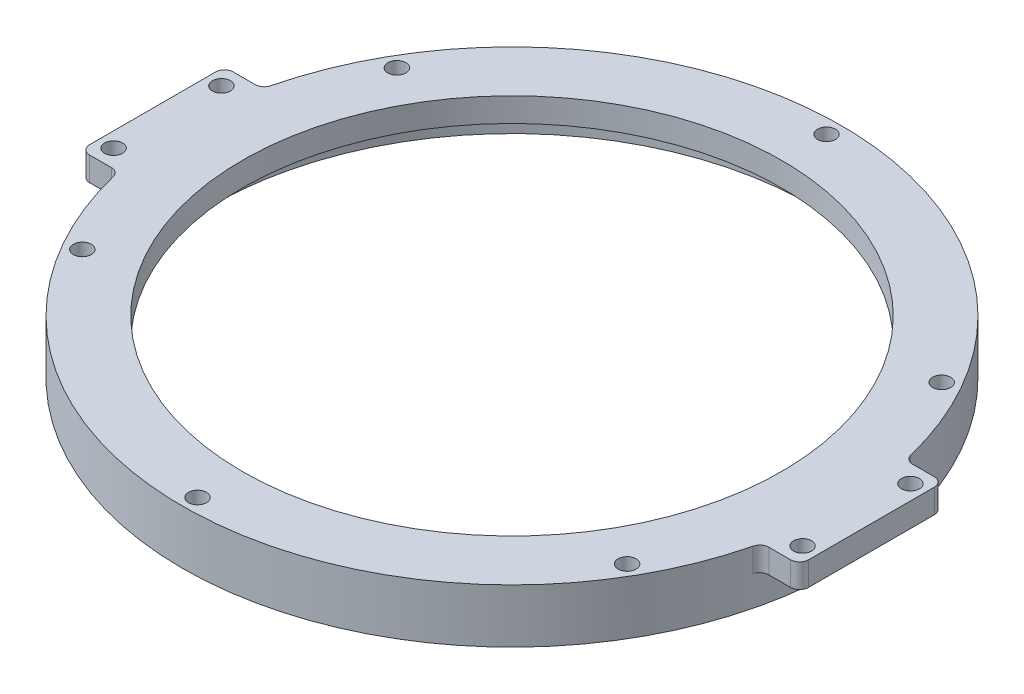
ISO-10303-21;
HEADER;
FILE_DESCRIPTION(('STEP AP214'),'2;1');
FILE_NAME('part.step','',(''),(''),'','','');
FILE_SCHEMA(('AUTOMOTIVE_DESIGN { 1 0 10303 214 1 1 1 1 }'));
ENDSEC;
DATA;
#1=APPLICATION_CONTEXT('core data for automotive mechanical design processes');
#2=APPLICATION_PROTOCOL_DEFINITION('international standard','automotive_design',2000,#1);
#3=PRODUCT_CONTEXT('',#1,'mechanical');
#4=PRODUCT('Part','Part','',(#3));
#5=PRODUCT_RELATED_PRODUCT_CATEGORY('part','',(#4));
#6=PRODUCT_DEFINITION_FORMATION('','',#4);
#7=PRODUCT_DEFINITION_CONTEXT('part definition',#1,'design');
#8=PRODUCT_DEFINITION('design','',#6,#7);
#9=PRODUCT_DEFINITION_SHAPE('','',#8);
#10=(LENGTH_UNIT() NAMED_UNIT(*) SI_UNIT(.MILLI.,.METRE.));
#11=(NAMED_UNIT(*) PLANE_ANGLE_UNIT() SI_UNIT($,.RADIAN.));
#12=(NAMED_UNIT(*) SI_UNIT($,.STERADIAN.) SOLID_ANGLE_UNIT());
#13=UNCERTAINTY_MEASURE_WITH_UNIT(LENGTH_MEASURE(1.E-05),#10,'distance_accuracy_value','');
#14=(GEOMETRIC_REPRESENTATION_CONTEXT(3) GLOBAL_UNCERTAINTY_ASSIGNED_CONTEXT((#13)) GLOBAL_UNIT_ASSIGNED_CONTEXT((#10,
#11,#12)) REPRESENTATION_CONTEXT('',''));
#15=CARTESIAN_POINT('',(0.,0.,0.));
#16=DIRECTION('',(0.,0.,1.));
#17=DIRECTION('',(1.,0.,0.));
#18=AXIS2_PLACEMENT_3D('',#15,#16,#17);
#19=CARTESIAN_POINT('',(0.,0.,0.));
#20=DIRECTION('',(0.,1.,0.));
#21=DIRECTION('',(0.,0.,1.));
#22=AXIS2_PLACEMENT_3D('',#19,#20,#21);
#23=PLANE('',#22);
#24=CARTESIAN_POINT('',(0.,0.,0.));
#25=DIRECTION('',(0.,1.,0.));
#26=DIRECTION('',(0.,0.,1.));
#27=AXIS2_PLACEMENT_3D('',#24,#25,#26);
#28=CIRCLE('',#27,45.);
#29=CARTESIAN_POINT('',(0.,0.,45.));
#30=VERTEX_POINT('',#29);
#31=EDGE_CURVE('E281',#30,#30,#28,.T.);
#32=ORIENTED_EDGE('',*,*,#31,.T.);
#33=EDGE_LOOP('',(#32));
#34=FACE_BOUND('',#33,.T.);
#35=CARTESIAN_POINT('',(0.,0.,0.));
#36=DIRECTION('',(0.,1.,0.));
#37=DIRECTION('',(0.,0.,1.));
#38=AXIS2_PLACEMENT_3D('',#35,#36,#37);
#39=CIRCLE('',#38,50.);
#40=CARTESIAN_POINT('',(0.,0.,50.));
#41=VERTEX_POINT('',#40);
#42=EDGE_CURVE('E11',#41,#41,#39,.T.);
#43=ORIENTED_EDGE('',*,*,#42,.F.);
#44=EDGE_LOOP('',(#43));
#45=FACE_BOUND('',#44,.T.);
#46=ADVANCED_FACE('F47',(#34,#45),#23,.F.);
#47=CARTESIAN_POINT('',(57.5,0.,9.00000000000001));
#48=DIRECTION('',(0.,1.,0.));
#49=DIRECTION('',(0.,0.,1.));
#50=AXIS2_PLACEMENT_3D('',#47,#48,#49);
#51=CIRCLE('',#50,1.5);
#52=CARTESIAN_POINT('',(57.5,0.,10.5));
#53=VERTEX_POINT('',#52);
#54=EDGE_CURVE('E285',#53,#53,#51,.F.);
#55=ORIENTED_EDGE('',*,*,#54,.F.);
#56=EDGE_LOOP('',(#55));
#57=FACE_BOUND('',#56,.T.);
#58=CARTESIAN_POINT('',(57.5,0.,-8.99999999999999));
#59=DIRECTION('',(0.,1.,0.));
#60=DIRECTION('',(0.,0.,1.));
#61=AXIS2_PLACEMENT_3D('',#58,#59,#60);
#62=CIRCLE('',#61,1.5);
#63=CARTESIAN_POINT('',(57.5,0.,-7.49999999999999));
#64=VERTEX_POINT('',#63);
#65=EDGE_CURVE('E269',#64,#64,#62,.F.);
#66=ORIENTED_EDGE('',*,*,#65,.F.);
#67=EDGE_LOOP('',(#66));
#68=FACE_BOUND('',#67,.T.);
#69=CARTESIAN_POINT('',(54.8634668973808,0.,13.5));
#70=DIRECTION('',(0.,1.,0.));
#71=DIRECTION('',(0.,0.,1.));
#72=AXIS2_PLACEMENT_3D('',#69,#70,#71);
#73=CIRCLE('',#72,1.5);
#74=CARTESIAN_POINT('',(54.8634668973808,0.,12.));
#75=VERTEX_POINT('',#74);
#76=CARTESIAN_POINT('',(53.4069146788663,0.,13.141592920354));
#77=VERTEX_POINT('',#76);
#78=EDGE_CURVE('E244',#75,#77,#73,.T.);
#79=ORIENTED_EDGE('',*,*,#78,.T.);
#80=CARTESIAN_POINT('',(0.,0.,0.));
#81=DIRECTION('',(0.,1.,0.));
#82=DIRECTION('',(0.,0.,1.));
#83=AXIS2_PLACEMENT_3D('',#80,#81,#82);
#84=CIRCLE('',#83,55.);
#85=CARTESIAN_POINT('',(53.4069146788663,0.,-13.141592920354));
#86=VERTEX_POINT('',#85);
#87=EDGE_CURVE('E343',#77,#86,#84,.T.);
#88=ORIENTED_EDGE('',*,*,#87,.T.);
#89=CARTESIAN_POINT('',(54.8634668973808,0.,-13.5));
#90=DIRECTION('',(0.,1.,0.));
#91=DIRECTION('',(0.,0.,1.));
#92=AXIS2_PLACEMENT_3D('',#89,#90,#91);
#93=CIRCLE('',#92,1.5);
#94=CARTESIAN_POINT('',(54.8634668973808,0.,-12.));
#95=VERTEX_POINT('',#94);
#96=EDGE_CURVE('E266',#95,#86,#93,.F.);
#97=ORIENTED_EDGE('',*,*,#96,.F.);
#98=DIRECTION('',(1.,0.,0.));
#99=VECTOR('',#98,1.);
#100=CARTESIAN_POINT('',(0.,0.,-12.));
#101=LINE('',#100,#99);
#102=CARTESIAN_POINT('',(58.5,0.,-12.));
#103=VERTEX_POINT('',#102);
#104=EDGE_CURVE('E169',#95,#103,#101,.T.);
#105=ORIENTED_EDGE('',*,*,#104,.T.);
#106=CARTESIAN_POINT('',(58.5,0.,-10.5));
#107=DIRECTION('',(0.,1.,0.));
#108=DIRECTION('',(0.,0.,1.));
#109=AXIS2_PLACEMENT_3D('',#106,#107,#108);
#110=CIRCLE('',#109,1.5);
#111=CARTESIAN_POINT('',(60.,0.,-10.5));
#112=VERTEX_POINT('',#111);
#113=EDGE_CURVE('E260',#103,#112,#110,.F.);
#114=ORIENTED_EDGE('',*,*,#113,.T.);
#115=DIRECTION('',(0.,0.,1.));
#116=VECTOR('',#115,1.);
#117=CARTESIAN_POINT('',(60.,0.,0.));
#118=LINE('',#117,#116);
#119=CARTESIAN_POINT('',(60.,0.,10.5));
#120=VERTEX_POINT('',#119);
#121=EDGE_CURVE('E256',#112,#120,#118,.T.);
#122=ORIENTED_EDGE('',*,*,#121,.T.);
#123=CARTESIAN_POINT('',(58.5,0.,10.5));
#124=DIRECTION('',(0.,1.,0.));
#125=DIRECTION('',(0.,0.,1.));
#126=AXIS2_PLACEMENT_3D('',#123,#124,#125);
#127=CIRCLE('',#126,1.5);
#128=CARTESIAN_POINT('',(58.5,0.,12.));
#129=VERTEX_POINT('',#128);
#130=EDGE_CURVE('E252',#120,#129,#127,.F.);
#131=ORIENTED_EDGE('',*,*,#130,.T.);
#132=DIRECTION('',(-1.,0.,0.));
#133=VECTOR('',#132,1.);
#134=CARTESIAN_POINT('',(0.,0.,12.));
#135=LINE('',#134,#133);
#136=EDGE_CURVE('E248',#129,#75,#135,.T.);
#137=ORIENTED_EDGE('',*,*,#136,.T.);
#138=EDGE_LOOP('',(#79,#88,#97,#105,#114,#122,#131,#137));
#139=FACE_BOUND('',#138,.T.);
#140=ADVANCED_FACE('F400',(#57,#68,#139),#23,.F.);
#141=CARTESIAN_POINT('',(-54.8634668973808,4.,-13.5));
#142=DIRECTION('',(0.,-1.,0.));
#143=DIRECTION('',(0.,0.,-1.));
#144=AXIS2_PLACEMENT_3D('',#141,#142,#143);
#145=CYLINDRICAL_SURFACE('',#144,1.5);
#146=CARTESIAN_POINT('',(-54.8634668973808,0.,-13.5));
#147=DIRECTION('',(0.,1.,0.));
#148=DIRECTION('',(0.,0.,1.));
#149=AXIS2_PLACEMENT_3D('',#146,#147,#148);
#150=CIRCLE('',#149,1.5);
#151=CARTESIAN_POINT('',(-54.8634668973808,0.,-12.));
#152=VERTEX_POINT('',#151);
#153=CARTESIAN_POINT('',(-53.4069146788663,0.,-13.141592920354));
#154=VERTEX_POINT('',#153);
#155=EDGE_CURVE('E215',#152,#154,#150,.T.);
#156=ORIENTED_EDGE('',*,*,#155,.F.);
#157=DIRECTION('',(0.,-1.,0.));
#158=VECTOR('',#157,1.);
#159=CARTESIAN_POINT('',(-54.8634668973808,4.,-12.));
#160=LINE('',#159,#158);
#161=CARTESIAN_POINT('',(-54.8634668973808,4.,-12.));
#162=VERTEX_POINT('',#161);
#163=EDGE_CURVE('E51',#162,#152,#160,.T.);
#164=ORIENTED_EDGE('',*,*,#163,.F.);
#165=CARTESIAN_POINT('',(-54.8634668973808,4.,-13.5));
#166=DIRECTION('',(0.,1.,0.));
#167=DIRECTION('',(0.,0.,1.));
#168=AXIS2_PLACEMENT_3D('',#165,#166,#167);
#169=CIRCLE('',#168,1.5);
#170=CARTESIAN_POINT('',(-53.4069146788663,4.,-13.141592920354));
#171=VERTEX_POINT('',#170);
#172=EDGE_CURVE('E558',#162,#171,#169,.T.);
#173=ORIENTED_EDGE('',*,*,#172,.T.);
#174=DIRECTION('',(0.,-1.,0.));
#175=VECTOR('',#174,1.);
#176=CARTESIAN_POINT('',(-53.4069146788663,4.,-13.141592920354));
#177=LINE('',#176,#175);
#178=EDGE_CURVE('E214',#171,#154,#177,.T.);
#179=ORIENTED_EDGE('',*,*,#178,.T.);
#180=EDGE_LOOP('',(#156,#164,#173,#179));
#181=FACE_BOUND('',#180,.T.);
#182=ADVANCED_FACE('F407',(#181),#145,.F.);
#183=CARTESIAN_POINT('',(0.,4.,-12.));
#184=DIRECTION('',(0.,0.,1.));
#185=DIRECTION('',(1.,0.,0.));
#186=AXIS2_PLACEMENT_3D('',#183,#184,#185);
#187=PLANE('',#186);
#188=DIRECTION('',(-1.,0.,0.));
#189=VECTOR('',#188,1.);
#190=CARTESIAN_POINT('',(0.,0.,-12.));
#191=LINE('',#190,#189);
#192=CARTESIAN_POINT('',(-58.5,0.,-12.));
#193=VERTEX_POINT('',#192);
#194=EDGE_CURVE('E219',#152,#193,#191,.T.);
#195=ORIENTED_EDGE('',*,*,#194,.T.);
#196=DIRECTION('',(0.,-1.,0.));
#197=VECTOR('',#196,1.);
#198=CARTESIAN_POINT('',(-58.5,4.,-12.));
#199=LINE('',#198,#197);
#200=CARTESIAN_POINT('',(-58.5,4.,-12.));
#201=VERTEX_POINT('',#200);
#202=EDGE_CURVE('E332',#201,#193,#199,.T.);
#203=ORIENTED_EDGE('',*,*,#202,.F.);
#204=DIRECTION('',(-1.,0.,0.));
#205=VECTOR('',#204,1.);
#206=CARTESIAN_POINT('',(0.,4.,-12.));
#207=LINE('',#206,#205);
#208=EDGE_CURVE('E561',#162,#201,#207,.T.);
#209=ORIENTED_EDGE('',*,*,#208,.F.);
#210=ORIENTED_EDGE('',*,*,#163,.T.);
#211=EDGE_LOOP('',(#195,#203,#209,#210));
#212=FACE_BOUND('',#211,.T.);
#213=ADVANCED_FACE('F490',(#212),#187,.F.);
#214=CARTESIAN_POINT('',(-58.5,4.,-10.5));
#215=DIRECTION('',(0.,-1.,0.));
#216=DIRECTION('',(0.,0.,-1.));
#217=AXIS2_PLACEMENT_3D('',#214,#215,#216);
#218=CYLINDRICAL_SURFACE('',#217,1.5);
#219=CARTESIAN_POINT('',(-58.5,0.,-10.5));
#220=DIRECTION('',(0.,1.,0.));
#221=DIRECTION('',(0.,0.,1.));
#222=AXIS2_PLACEMENT_3D('',#219,#220,#221);
#223=CIRCLE('',#222,1.5);
#224=CARTESIAN_POINT('',(-60.,0.,-10.5));
#225=VERTEX_POINT('',#224);
#226=EDGE_CURVE('E224',#193,#225,#223,.T.);
#227=ORIENTED_EDGE('',*,*,#226,.T.);
#228=DIRECTION('',(0.,-1.,0.));
#229=VECTOR('',#228,1.);
#230=CARTESIAN_POINT('',(-60.,4.,-10.5));
#231=LINE('',#230,#229);
#232=CARTESIAN_POINT('',(-60.,4.,-10.5));
#233=VERTEX_POINT('',#232);
#234=EDGE_CURVE('E329',#233,#225,#231,.T.);
#235=ORIENTED_EDGE('',*,*,#234,.F.);
#236=CARTESIAN_POINT('',(-58.5,4.,-10.5));
#237=DIRECTION('',(0.,1.,0.));
#238=DIRECTION('',(0.,0.,1.));
#239=AXIS2_PLACEMENT_3D('',#236,#237,#238);
#240=CIRCLE('',#239,1.5);
#241=EDGE_CURVE('E565',#201,#233,#240,.T.);
#242=ORIENTED_EDGE('',*,*,#241,.F.);
#243=ORIENTED_EDGE('',*,*,#202,.T.);
#244=EDGE_LOOP('',(#227,#235,#242,#243));
#245=FACE_BOUND('',#244,.T.);
#246=ADVANCED_FACE('F486',(#245),#218,.T.);
#247=CARTESIAN_POINT('',(-60.,4.,0.));
#248=DIRECTION('',(1.,0.,0.));
#249=DIRECTION('',(0.,0.,-1.));
#250=AXIS2_PLACEMENT_3D('',#247,#248,#249);
#251=PLANE('',#250);
#252=DIRECTION('',(0.,0.,1.));
#253=VECTOR('',#252,1.);
#254=CARTESIAN_POINT('',(-60.,0.,0.));
#255=LINE('',#254,#253);
#256=CARTESIAN_POINT('',(-60.,0.,10.5));
#257=VERTEX_POINT('',#256);
#258=EDGE_CURVE('E228',#225,#257,#255,.T.);
#259=ORIENTED_EDGE('',*,*,#258,.T.);
#260=DIRECTION('',(0.,-1.,0.));
#261=VECTOR('',#260,1.);
#262=CARTESIAN_POINT('',(-60.,4.,10.5));
#263=LINE('',#262,#261);
#264=CARTESIAN_POINT('',(-60.,4.,10.5));
#265=VERTEX_POINT('',#264);
#266=EDGE_CURVE('E325',#265,#257,#263,.T.);
#267=ORIENTED_EDGE('',*,*,#266,.F.);
#268=DIRECTION('',(0.,0.,1.));
#269=VECTOR('',#268,1.);
#270=CARTESIAN_POINT('',(-60.,4.,0.));
#271=LINE('',#270,#269);
#272=EDGE_CURVE('E569',#233,#265,#271,.T.);
#273=ORIENTED_EDGE('',*,*,#272,.F.);
#274=ORIENTED_EDGE('',*,*,#234,.T.);
#275=EDGE_LOOP('',(#259,#267,#273,#274));
#276=FACE_BOUND('',#275,.T.);
#277=ADVANCED_FACE('F482',(#276),#251,.F.);
#278=CARTESIAN_POINT('',(-58.5,4.,10.5));
#279=DIRECTION('',(0.,-1.,0.));
#280=DIRECTION('',(0.,0.,-1.));
#281=AXIS2_PLACEMENT_3D('',#278,#279,#280);
#282=CYLINDRICAL_SURFACE('',#281,1.5);
#283=CARTESIAN_POINT('',(-58.5,0.,10.5));
#284=DIRECTION('',(0.,1.,0.));
#285=DIRECTION('',(0.,0.,1.));
#286=AXIS2_PLACEMENT_3D('',#283,#284,#285);
#287=CIRCLE('',#286,1.5);
#288=CARTESIAN_POINT('',(-58.5,0.,12.));
#289=VERTEX_POINT('',#288);
#290=EDGE_CURVE('E232',#257,#289,#287,.T.);
#291=ORIENTED_EDGE('',*,*,#290,.T.);
#292=DIRECTION('',(0.,-1.,0.));
#293=VECTOR('',#292,1.);
#294=CARTESIAN_POINT('',(-58.5,4.,12.));
#295=LINE('',#294,#293);
#296=CARTESIAN_POINT('',(-58.5,4.,12.));
#297=VERTEX_POINT('',#296);
#298=EDGE_CURVE('E321',#297,#289,#295,.T.);
#299=ORIENTED_EDGE('',*,*,#298,.F.);
#300=CARTESIAN_POINT('',(-58.5,4.,10.5));
#301=DIRECTION('',(0.,1.,0.));
#302=DIRECTION('',(0.,0.,1.));
#303=AXIS2_PLACEMENT_3D('',#300,#301,#302);
#304=CIRCLE('',#303,1.5);
#305=EDGE_CURVE('E573',#265,#297,#304,.T.);
#306=ORIENTED_EDGE('',*,*,#305,.F.);
#307=ORIENTED_EDGE('',*,*,#266,.T.);
#308=EDGE_LOOP('',(#291,#299,#306,#307));
#309=FACE_BOUND('',#308,.T.);
#310=ADVANCED_FACE('F478',(#309),#282,.T.);
#311=CARTESIAN_POINT('',(0.,4.,12.));
#312=DIRECTION('',(0.,0.,-1.));
#313=DIRECTION('',(-1.,0.,0.));
#314=AXIS2_PLACEMENT_3D('',#311,#312,#313);
#315=PLANE('',#314);
#316=DIRECTION('',(1.,0.,0.));
#317=VECTOR('',#316,1.);
#318=CARTESIAN_POINT('',(0.,0.,12.));
#319=LINE('',#318,#317);
#320=CARTESIAN_POINT('',(-54.8634668973808,0.,12.));
#321=VERTEX_POINT('',#320);
#322=EDGE_CURVE('E236',#289,#321,#319,.T.);
#323=ORIENTED_EDGE('',*,*,#322,.T.);
#324=DIRECTION('',(0.,-1.,0.));
#325=VECTOR('',#324,1.);
#326=CARTESIAN_POINT('',(-54.8634668973808,4.,12.));
#327=LINE('',#326,#325);
#328=CARTESIAN_POINT('',(-54.8634668973808,4.,12.));
#329=VERTEX_POINT('',#328);
#330=EDGE_CURVE('E317',#329,#321,#327,.T.);
#331=ORIENTED_EDGE('',*,*,#330,.F.);
#332=DIRECTION('',(1.,0.,0.));
#333=VECTOR('',#332,1.);
#334=CARTESIAN_POINT('',(0.,4.,12.));
#335=LINE('',#334,#333);
#336=EDGE_CURVE('E577',#297,#329,#335,.T.);
#337=ORIENTED_EDGE('',*,*,#336,.F.);
#338=ORIENTED_EDGE('',*,*,#298,.T.);
#339=EDGE_LOOP('',(#323,#331,#337,#338));
#340=FACE_BOUND('',#339,.T.);
#341=ADVANCED_FACE('F474',(#340),#315,.F.);
#342=CARTESIAN_POINT('',(-54.8634668973808,4.,13.5));
#343=DIRECTION('',(0.,-1.,0.));
#344=DIRECTION('',(0.,0.,-1.));
#345=AXIS2_PLACEMENT_3D('',#342,#343,#344);
#346=CYLINDRICAL_SURFACE('',#345,1.5);
#347=CARTESIAN_POINT('',(-54.8634668973808,0.,13.5));
#348=DIRECTION('',(0.,1.,0.));
#349=DIRECTION('',(0.,0.,1.));
#350=AXIS2_PLACEMENT_3D('',#347,#348,#349);
#351=CIRCLE('',#350,1.5);
#352=CARTESIAN_POINT('',(-53.4069146788663,0.,13.141592920354));
#353=VERTEX_POINT('',#352);
#354=EDGE_CURVE('E240',#321,#353,#351,.F.);
#355=ORIENTED_EDGE('',*,*,#354,.T.);
#356=DIRECTION('',(0.,-1.,0.));
#357=VECTOR('',#356,1.);
#358=CARTESIAN_POINT('',(-53.4069146788663,4.,13.141592920354));
#359=LINE('',#358,#357);
#360=CARTESIAN_POINT('',(-53.4069146788663,4.,13.141592920354));
#361=VERTEX_POINT('',#360);
#362=EDGE_CURVE('E313',#361,#353,#359,.T.);
#363=ORIENTED_EDGE('',*,*,#362,.F.);
#364=CARTESIAN_POINT('',(-54.8634668973808,4.,13.5));
#365=DIRECTION('',(0.,1.,0.));
#366=DIRECTION('',(0.,0.,1.));
#367=AXIS2_PLACEMENT_3D('',#364,#365,#366);
#368=CIRCLE('',#367,1.5);
#369=EDGE_CURVE('E581',#329,#361,#368,.F.);
#370=ORIENTED_EDGE('',*,*,#369,.F.);
#371=ORIENTED_EDGE('',*,*,#330,.T.);
#372=EDGE_LOOP('',(#355,#363,#370,#371));
#373=FACE_BOUND('',#372,.T.);
#374=ADVANCED_FACE('F470',(#373),#346,.F.);
#375=CARTESIAN_POINT('',(54.8634668973808,4.,13.5));
#376=DIRECTION('',(0.,-1.,0.));
#377=DIRECTION('',(0.,0.,-1.));
#378=AXIS2_PLACEMENT_3D('',#375,#376,#377);
#379=CYLINDRICAL_SURFACE('',#378,1.5);
#380=ORIENTED_EDGE('',*,*,#78,.F.);
#381=DIRECTION('',(0.,-1.,0.));
#382=VECTOR('',#381,1.);
#383=CARTESIAN_POINT('',(54.8634668973808,4.,12.));
#384=LINE('',#383,#382);
#385=CARTESIAN_POINT('',(54.8634668973808,4.,12.));
#386=VERTEX_POINT('',#385);
#387=EDGE_CURVE('E306',#386,#75,#384,.T.);
#388=ORIENTED_EDGE('',*,*,#387,.F.);
#389=CARTESIAN_POINT('',(54.8634668973808,4.,13.5));
#390=DIRECTION('',(0.,1.,0.));
#391=DIRECTION('',(0.,0.,1.));
#392=AXIS2_PLACEMENT_3D('',#389,#390,#391);
#393=CIRCLE('',#392,1.5);
#394=CARTESIAN_POINT('',(53.4069146788663,4.,13.141592920354));
#395=VERTEX_POINT('',#394);
#396=EDGE_CURVE('E588',#386,#395,#393,.T.);
#397=ORIENTED_EDGE('',*,*,#396,.T.);
#398=DIRECTION('',(0.,-1.,0.));
#399=VECTOR('',#398,1.);
#400=CARTESIAN_POINT('',(53.4069146788663,4.,13.141592920354));
#401=LINE('',#400,#399);
#402=EDGE_CURVE('E309',#395,#77,#401,.T.);
#403=ORIENTED_EDGE('',*,*,#402,.T.);
#404=EDGE_LOOP('',(#380,#388,#397,#403));
#405=FACE_BOUND('',#404,.T.);
#406=ADVANCED_FACE('F466',(#405),#379,.F.);
#407=CARTESIAN_POINT('',(0.,4.,12.));
#408=DIRECTION('',(0.,0.,1.));
#409=DIRECTION('',(1.,0.,0.));
#410=AXIS2_PLACEMENT_3D('',#407,#408,#409);
#411=PLANE('',#410);
#412=ORIENTED_EDGE('',*,*,#136,.F.);
#413=DIRECTION('',(0.,-1.,0.));
#414=VECTOR('',#413,1.);
#415=CARTESIAN_POINT('',(58.5,4.,12.));
#416=LINE('',#415,#414);
#417=CARTESIAN_POINT('',(58.5,4.,12.));
#418=VERTEX_POINT('',#417);
#419=EDGE_CURVE('E303',#418,#129,#416,.T.);
#420=ORIENTED_EDGE('',*,*,#419,.F.);
#421=DIRECTION('',(-1.,0.,0.));
#422=VECTOR('',#421,1.);
#423=CARTESIAN_POINT('',(0.,4.,12.));
#424=LINE('',#423,#422);
#425=EDGE_CURVE('E592',#418,#386,#424,.T.);
#426=ORIENTED_EDGE('',*,*,#425,.T.);
#427=ORIENTED_EDGE('',*,*,#387,.T.);
#428=EDGE_LOOP('',(#412,#420,#426,#427));
#429=FACE_BOUND('',#428,.T.);
#430=ADVANCED_FACE('F462',(#429),#411,.T.);
#431=CARTESIAN_POINT('',(58.5,4.,10.5));
#432=DIRECTION('',(0.,-1.,0.));
#433=DIRECTION('',(0.,0.,-1.));
#434=AXIS2_PLACEMENT_3D('',#431,#432,#433);
#435=CYLINDRICAL_SURFACE('',#434,1.5);
#436=ORIENTED_EDGE('',*,*,#130,.F.);
#437=DIRECTION('',(0.,-1.,0.));
#438=VECTOR('',#437,1.);
#439=CARTESIAN_POINT('',(60.,4.,10.5));
#440=LINE('',#439,#438);
#441=CARTESIAN_POINT('',(60.,4.,10.5));
#442=VERTEX_POINT('',#441);
#443=EDGE_CURVE('E300',#442,#120,#440,.T.);
#444=ORIENTED_EDGE('',*,*,#443,.F.);
#445=CARTESIAN_POINT('',(58.5,4.,10.5));
#446=DIRECTION('',(0.,1.,0.));
#447=DIRECTION('',(0.,0.,1.));
#448=AXIS2_PLACEMENT_3D('',#445,#446,#447);
#449=CIRCLE('',#448,1.5);
#450=EDGE_CURVE('E596',#442,#418,#449,.F.);
#451=ORIENTED_EDGE('',*,*,#450,.T.);
#452=ORIENTED_EDGE('',*,*,#419,.T.);
#453=EDGE_LOOP('',(#436,#444,#451,#452));
#454=FACE_BOUND('',#453,.T.);
#455=ADVANCED_FACE('F458',(#454),#435,.T.);
#456=CARTESIAN_POINT('',(60.,4.,0.));
#457=DIRECTION('',(1.,0.,0.));
#458=DIRECTION('',(0.,0.,-1.));
#459=AXIS2_PLACEMENT_3D('',#456,#457,#458);
#460=PLANE('',#459);
#461=ORIENTED_EDGE('',*,*,#121,.F.);
#462=DIRECTION('',(0.,-1.,0.));
#463=VECTOR('',#462,1.);
#464=CARTESIAN_POINT('',(60.,4.,-10.5));
#465=LINE('',#464,#463);
#466=CARTESIAN_POINT('',(60.,4.,-10.5));
#467=VERTEX_POINT('',#466);
#468=EDGE_CURVE('E297',#467,#112,#465,.T.);
#469=ORIENTED_EDGE('',*,*,#468,.F.);
#470=DIRECTION('',(0.,0.,1.));
#471=VECTOR('',#470,1.);
#472=CARTESIAN_POINT('',(60.,4.,0.));
#473=LINE('',#472,#471);
#474=EDGE_CURVE('E188',#467,#442,#473,.T.);
#475=ORIENTED_EDGE('',*,*,#474,.T.);
#476=ORIENTED_EDGE('',*,*,#443,.T.);
#477=EDGE_LOOP('',(#461,#469,#475,#476));
#478=FACE_BOUND('',#477,.T.);
#479=ADVANCED_FACE('F454',(#478),#460,.T.);
#480=CARTESIAN_POINT('',(58.5,4.,-10.5));
#481=DIRECTION('',(0.,-1.,0.));
#482=DIRECTION('',(0.,0.,-1.));
#483=AXIS2_PLACEMENT_3D('',#480,#481,#482);
#484=CYLINDRICAL_SURFACE('',#483,1.5);
#485=ORIENTED_EDGE('',*,*,#113,.F.);
#486=DIRECTION('',(0.,-1.,0.));
#487=VECTOR('',#486,1.);
#488=CARTESIAN_POINT('',(58.5,4.,-12.));
#489=LINE('',#488,#487);
#490=CARTESIAN_POINT('',(58.5,4.,-12.));
#491=VERTEX_POINT('',#490);
#492=EDGE_CURVE('E112',#491,#103,#489,.T.);
#493=ORIENTED_EDGE('',*,*,#492,.F.);
#494=CARTESIAN_POINT('',(58.5,4.,-10.5));
#495=DIRECTION('',(0.,1.,0.));
#496=DIRECTION('',(0.,0.,1.));
#497=AXIS2_PLACEMENT_3D('',#494,#495,#496);
#498=CIRCLE('',#497,1.5);
#499=EDGE_CURVE('E184',#491,#467,#498,.F.);
#500=ORIENTED_EDGE('',*,*,#499,.T.);
#501=ORIENTED_EDGE('',*,*,#468,.T.);
#502=EDGE_LOOP('',(#485,#493,#500,#501));
#503=FACE_BOUND('',#502,.T.);
#504=ADVANCED_FACE('F451',(#503),#484,.T.);
#505=CARTESIAN_POINT('',(0.,4.,-12.));
#506=DIRECTION('',(0.,0.,-1.));
#507=DIRECTION('',(-1.,0.,0.));
#508=AXIS2_PLACEMENT_3D('',#505,#506,#507);
#509=PLANE('',#508);
#510=ORIENTED_EDGE('',*,*,#104,.F.);
#511=DIRECTION('',(0.,-1.,0.));
#512=VECTOR('',#511,1.);
#513=CARTESIAN_POINT('',(54.8634668973808,4.,-12.));
#514=LINE('',#513,#512);
#515=CARTESIAN_POINT('',(54.8634668973808,4.,-12.));
#516=VERTEX_POINT('',#515);
#517=EDGE_CURVE('E120',#516,#95,#514,.T.);
#518=ORIENTED_EDGE('',*,*,#517,.F.);
#519=DIRECTION('',(1.,0.,0.));
#520=VECTOR('',#519,1.);
#521=CARTESIAN_POINT('',(0.,4.,-12.));
#522=LINE('',#521,#520);
#523=EDGE_CURVE('E167',#516,#491,#522,.T.);
#524=ORIENTED_EDGE('',*,*,#523,.T.);
#525=ORIENTED_EDGE('',*,*,#492,.T.);
#526=EDGE_LOOP('',(#510,#518,#524,#525));
#527=FACE_BOUND('',#526,.T.);
#528=ADVANCED_FACE('F165',(#527),#509,.T.);
#529=CARTESIAN_POINT('',(54.8634668973808,4.,-13.5));
#530=DIRECTION('',(0.,-1.,0.));
#531=DIRECTION('',(0.,0.,-1.));
#532=AXIS2_PLACEMENT_3D('',#529,#530,#531);
#533=CYLINDRICAL_SURFACE('',#532,1.5);
#534=ORIENTED_EDGE('',*,*,#96,.T.);
#535=DIRECTION('',(0.,-1.,0.));
#536=VECTOR('',#535,1.);
#537=CARTESIAN_POINT('',(53.4069146788663,4.,-13.141592920354));
#538=LINE('',#537,#536);
#539=CARTESIAN_POINT('',(53.4069146788663,4.,-13.141592920354));
#540=VERTEX_POINT('',#539);
#541=EDGE_CURVE('E171',#540,#86,#538,.T.);
#542=ORIENTED_EDGE('',*,*,#541,.F.);
#543=CARTESIAN_POINT('',(54.8634668973808,4.,-13.5));
#544=DIRECTION('',(0.,1.,0.));
#545=DIRECTION('',(0.,0.,1.));
#546=AXIS2_PLACEMENT_3D('',#543,#544,#545);
#547=CIRCLE('',#546,1.5);
#548=EDGE_CURVE('E174',#516,#540,#547,.F.);
#549=ORIENTED_EDGE('',*,*,#548,.F.);
#550=ORIENTED_EDGE('',*,*,#517,.T.);
#551=EDGE_LOOP('',(#534,#542,#549,#550));
#552=FACE_BOUND('',#551,.T.);
#553=ADVANCED_FACE('F175',(#552),#533,.F.);
#554=CARTESIAN_POINT('',(0.,4.,0.));
#555=DIRECTION('',(0.,-1.,0.));
#556=DIRECTION('',(0.,0.,-1.));
#557=AXIS2_PLACEMENT_3D('',#554,#555,#556);
#558=CYLINDRICAL_SURFACE('',#557,45.);
#559=CARTESIAN_POINT('',(0.,4.,0.));
#560=DIRECTION('',(0.,1.,0.));
#561=DIRECTION('',(0.,0.,1.));
#562=AXIS2_PLACEMENT_3D('',#559,#560,#561);
#563=CIRCLE('',#562,45.);
#564=CARTESIAN_POINT('',(0.,4.,45.));
#565=VERTEX_POINT('',#564);
#566=EDGE_CURVE('E206',#565,#565,#563,.T.);
#567=ORIENTED_EDGE('',*,*,#566,.T.);
#568=EDGE_LOOP('',(#567));
#569=FACE_BOUND('',#568,.T.);
#570=ORIENTED_EDGE('',*,*,#31,.F.);
#571=EDGE_LOOP('',(#570));
#572=FACE_BOUND('',#571,.T.);
#573=ADVANCED_FACE('F427',(#569,#572),#558,.F.);
#574=CARTESIAN_POINT('',(-57.5,4.,-8.99999999999999));
#575=DIRECTION('',(0.,-1.,0.));
#576=DIRECTION('',(0.,0.,-1.));
#577=AXIS2_PLACEMENT_3D('',#574,#575,#576);
#578=CYLINDRICAL_SURFACE('',#577,1.5);
#579=CARTESIAN_POINT('',(-57.5,4.,-8.99999999999999));
#580=DIRECTION('',(0.,1.,0.));
#581=DIRECTION('',(0.,0.,1.));
#582=AXIS2_PLACEMENT_3D('',#579,#580,#581);
#583=CIRCLE('',#582,1.5);
#584=CARTESIAN_POINT('',(-57.5,4.,-7.49999999999999));
#585=VERTEX_POINT('',#584);
#586=EDGE_CURVE('E202',#585,#585,#583,.T.);
#587=ORIENTED_EDGE('',*,*,#586,.T.);
#588=EDGE_LOOP('',(#587));
#589=FACE_BOUND('',#588,.T.);
#590=CARTESIAN_POINT('',(-57.5,0.,-8.99999999999999));
#591=DIRECTION('',(0.,1.,0.));
#592=DIRECTION('',(0.,0.,1.));
#593=AXIS2_PLACEMENT_3D('',#590,#591,#592);
#594=CIRCLE('',#593,1.5);
#595=CARTESIAN_POINT('',(-57.5,0.,-7.49999999999999));
#596=VERTEX_POINT('',#595);
#597=EDGE_CURVE('E277',#596,#596,#594,.T.);
#598=ORIENTED_EDGE('',*,*,#597,.F.);
#599=EDGE_LOOP('',(#598));
#600=FACE_BOUND('',#599,.T.);
#601=ADVANCED_FACE('F424',(#589,#600),#578,.F.);
#602=CARTESIAN_POINT('',(-57.5,4.,9.00000000000001));
#603=DIRECTION('',(0.,-1.,0.));
#604=DIRECTION('',(0.,0.,-1.));
#605=AXIS2_PLACEMENT_3D('',#602,#603,#604);
#606=CYLINDRICAL_SURFACE('',#605,1.5);
#607=CARTESIAN_POINT('',(-57.5,4.,9.00000000000001));
#608=DIRECTION('',(0.,1.,0.));
#609=DIRECTION('',(0.,0.,1.));
#610=AXIS2_PLACEMENT_3D('',#607,#608,#609);
#611=CIRCLE('',#610,1.5);
#612=CARTESIAN_POINT('',(-57.5,4.,10.5));
#613=VERTEX_POINT('',#612);
#614=EDGE_CURVE('E198',#613,#613,#611,.T.);
#615=ORIENTED_EDGE('',*,*,#614,.T.);
#616=EDGE_LOOP('',(#615));
#617=FACE_BOUND('',#616,.T.);
#618=CARTESIAN_POINT('',(-57.5,0.,9.00000000000001));
#619=DIRECTION('',(0.,1.,0.));
#620=DIRECTION('',(0.,0.,1.));
#621=AXIS2_PLACEMENT_3D('',#618,#619,#620);
#622=CIRCLE('',#621,1.5);
#623=CARTESIAN_POINT('',(-57.5,0.,10.5));
#624=VERTEX_POINT('',#623);
#625=EDGE_CURVE('E273',#624,#624,#622,.T.);
#626=ORIENTED_EDGE('',*,*,#625,.F.);
#627=EDGE_LOOP('',(#626));
#628=FACE_BOUND('',#627,.T.);
#629=ADVANCED_FACE('F426',(#617,#628),#606,.F.);
#630=CARTESIAN_POINT('',(57.5,4.,-8.99999999999999));
#631=DIRECTION('',(0.,-1.,0.));
#632=DIRECTION('',(0.,0.,-1.));
#633=AXIS2_PLACEMENT_3D('',#630,#631,#632);
#634=CYLINDRICAL_SURFACE('',#633,1.5);
#635=CARTESIAN_POINT('',(57.5,4.,-8.99999999999999));
#636=DIRECTION('',(0.,1.,0.));
#637=DIRECTION('',(0.,0.,1.));
#638=AXIS2_PLACEMENT_3D('',#635,#636,#637);
#639=CIRCLE('',#638,1.5);
#640=CARTESIAN_POINT('',(57.5,4.,-7.49999999999999));
#641=VERTEX_POINT('',#640);
#642=EDGE_CURVE('E194',#641,#641,#639,.F.);
#643=ORIENTED_EDGE('',*,*,#642,.F.);
#644=EDGE_LOOP('',(#643));
#645=FACE_BOUND('',#644,.T.);
#646=ORIENTED_EDGE('',*,*,#65,.T.);
#647=EDGE_LOOP('',(#646));
#648=FACE_BOUND('',#647,.T.);
#649=ADVANCED_FACE('F434',(#645,#648),#634,.F.);
#650=CARTESIAN_POINT('',(0.,4.,0.));
#651=DIRECTION('',(0.,-1.,0.));
#652=DIRECTION('',(0.,0.,-1.));
#653=AXIS2_PLACEMENT_3D('',#650,#651,#652);
#654=CYLINDRICAL_SURFACE('',#653,55.);
#655=ORIENTED_EDGE('',*,*,#541,.T.);
#656=ORIENTED_EDGE('',*,*,#87,.F.);
#657=ORIENTED_EDGE('',*,*,#402,.F.);
#658=CARTESIAN_POINT('',(0.,4.,0.));
#659=DIRECTION('',(0.,1.,0.));
#660=DIRECTION('',(0.,0.,1.));
#661=AXIS2_PLACEMENT_3D('',#658,#659,#660);
#662=CIRCLE('',#661,55.);
#663=EDGE_CURVE('E585',#361,#395,#662,.T.);
#664=ORIENTED_EDGE('',*,*,#663,.F.);
#665=ORIENTED_EDGE('',*,*,#362,.T.);
#666=EDGE_CURVE('E58',#154,#353,#84,.T.);
#667=ORIENTED_EDGE('',*,*,#666,.F.);
#668=ORIENTED_EDGE('',*,*,#178,.F.);
#669=CARTESIAN_POINT('',(0.,4.,0.));
#670=DIRECTION('',(0.,1.,0.));
#671=DIRECTION('',(0.,0.,1.));
#672=AXIS2_PLACEMENT_3D('',#669,#670,#671);
#673=CIRCLE('',#672,55.);
#674=EDGE_CURVE('E67',#540,#171,#673,.T.);
#675=ORIENTED_EDGE('',*,*,#674,.F.);
#676=EDGE_LOOP('',(#655,#656,#657,#664,#665,#667,#668,#675));
#677=FACE_BOUND('',#676,.T.);
#678=CARTESIAN_POINT('',(0.,-5.,0.));
#679=DIRECTION('',(0.,1.,0.));
#680=DIRECTION('',(0.,0.,1.));
#681=AXIS2_PLACEMENT_3D('',#678,#679,#680);
#682=CIRCLE('',#681,55.);
#683=CARTESIAN_POINT('',(0.,-5.,55.));
#684=VERTEX_POINT('',#683);
#685=EDGE_CURVE('E220',#684,#684,#682,.T.);
#686=ORIENTED_EDGE('',*,*,#685,.T.);
#687=EDGE_LOOP('',(#686));
#688=FACE_BOUND('',#687,.T.);
#689=ADVANCED_FACE('F386',(#677,#688),#654,.T.);
#690=CARTESIAN_POINT('',(0.,4.,-52.5));
#691=DIRECTION('',(0.,-1.,0.));
#692=DIRECTION('',(0.,0.,-1.));
#693=AXIS2_PLACEMENT_3D('',#690,#691,#692);
#694=CYLINDRICAL_SURFACE('',#693,1.5);
#695=CARTESIAN_POINT('',(0.,4.,-52.5));
#696=DIRECTION('',(0.,1.,0.));
#697=DIRECTION('',(0.,0.,1.));
#698=AXIS2_PLACEMENT_3D('',#695,#696,#697);
#699=CIRCLE('',#698,1.5);
#700=CARTESIAN_POINT('',(0.,4.,-51.));
#701=VERTEX_POINT('',#700);
#702=EDGE_CURVE('E554',#701,#701,#699,.T.);
#703=ORIENTED_EDGE('',*,*,#702,.T.);
#704=EDGE_LOOP('',(#703));
#705=FACE_BOUND('',#704,.T.);
#706=CARTESIAN_POINT('',(0.,-5.,-52.5));
#707=DIRECTION('',(0.,1.,0.));
#708=DIRECTION('',(0.,0.,1.));
#709=AXIS2_PLACEMENT_3D('',#706,#707,#708);
#710=CIRCLE('',#709,1.5);
#711=CARTESIAN_POINT('',(0.,-5.,-51.));
#712=VERTEX_POINT('',#711);
#713=EDGE_CURVE('E374',#712,#712,#710,.T.);
#714=ORIENTED_EDGE('',*,*,#713,.F.);
#715=EDGE_LOOP('',(#714));
#716=FACE_BOUND('',#715,.T.);
#717=ADVANCED_FACE('F445',(#705,#716),#694,.F.);
#718=CARTESIAN_POINT('',(45.4663336986831,4.,-26.2499999999999));
#719=DIRECTION('',(0.,-1.,0.));
#720=DIRECTION('',(0.,0.,-1.));
#721=AXIS2_PLACEMENT_3D('',#718,#719,#720);
#722=CYLINDRICAL_SURFACE('',#721,1.49999999999999);
#723=CARTESIAN_POINT('',(45.4663336986831,4.,-26.2499999999999));
#724=DIRECTION('',(0.,1.,0.));
#725=DIRECTION('',(0.,0.,1.));
#726=AXIS2_PLACEMENT_3D('',#723,#724,#725);
#727=CIRCLE('',#726,1.49999999999999);
#728=CARTESIAN_POINT('',(45.4663336986831,4.,-24.7499999999999));
#729=VERTEX_POINT('',#728);
#730=EDGE_CURVE('E550',#729,#729,#727,.T.);
#731=ORIENTED_EDGE('',*,*,#730,.T.);
#732=EDGE_LOOP('',(#731));
#733=FACE_BOUND('',#732,.T.);
#734=CARTESIAN_POINT('',(45.4663336986831,-5.,-26.2499999999999));
#735=DIRECTION('',(0.,1.,0.));
#736=DIRECTION('',(0.,0.,1.));
#737=AXIS2_PLACEMENT_3D('',#734,#735,#736);
#738=CIRCLE('',#737,1.49999999999999);
#739=CARTESIAN_POINT('',(45.4663336986831,-5.,-24.7499999999999));
#740=VERTEX_POINT('',#739);
#741=EDGE_CURVE('E370',#740,#740,#738,.T.);
#742=ORIENTED_EDGE('',*,*,#741,.F.);
#743=EDGE_LOOP('',(#742));
#744=FACE_BOUND('',#743,.T.);
#745=ADVANCED_FACE('F497',(#733,#744),#722,.F.);
#746=CARTESIAN_POINT('',(45.4663336986829,4.,26.2500000000002));
#747=DIRECTION('',(0.,-1.,0.));
#748=DIRECTION('',(0.,0.,-1.));
#749=AXIS2_PLACEMENT_3D('',#746,#747,#748);
#750=CYLINDRICAL_SURFACE('',#749,1.5);
#751=CARTESIAN_POINT('',(45.4663336986829,4.,26.2500000000002));
#752=DIRECTION('',(0.,1.,0.));
#753=DIRECTION('',(0.,0.,1.));
#754=AXIS2_PLACEMENT_3D('',#751,#752,#753);
#755=CIRCLE('',#754,1.5);
#756=CARTESIAN_POINT('',(45.4663336986829,4.,27.7500000000002));
#757=VERTEX_POINT('',#756);
#758=EDGE_CURVE('E543',#757,#757,#755,.T.);
#759=ORIENTED_EDGE('',*,*,#758,.T.);
#760=EDGE_LOOP('',(#759));
#761=FACE_BOUND('',#760,.T.);
#762=CARTESIAN_POINT('',(45.4663336986829,-5.,26.2500000000002));
#763=DIRECTION('',(0.,1.,0.));
#764=DIRECTION('',(0.,0.,1.));
#765=AXIS2_PLACEMENT_3D('',#762,#763,#764);
#766=CIRCLE('',#765,1.5);
#767=CARTESIAN_POINT('',(45.4663336986829,-5.,27.7500000000002));
#768=VERTEX_POINT('',#767);
#769=EDGE_CURVE('E366',#768,#768,#766,.T.);
#770=ORIENTED_EDGE('',*,*,#769,.F.);
#771=EDGE_LOOP('',(#770));
#772=FACE_BOUND('',#771,.T.);
#773=ADVANCED_FACE('F501',(#761,#772),#750,.F.);
#774=CARTESIAN_POINT('',(-3.60176144883005E-13,4.,52.5));
#775=DIRECTION('',(0.,-1.,0.));
#776=DIRECTION('',(0.,0.,-1.));
#777=AXIS2_PLACEMENT_3D('',#774,#775,#776);
#778=CYLINDRICAL_SURFACE('',#777,1.5);
#779=CARTESIAN_POINT('',(-3.60176144883005E-13,4.,52.5));
#780=DIRECTION('',(0.,1.,0.));
#781=DIRECTION('',(0.,0.,1.));
#782=AXIS2_PLACEMENT_3D('',#779,#780,#781);
#783=CIRCLE('',#782,1.5);
#784=CARTESIAN_POINT('',(-3.60176144883005E-13,4.,54.));
#785=VERTEX_POINT('',#784);
#786=EDGE_CURVE('E538',#785,#785,#783,.T.);
#787=ORIENTED_EDGE('',*,*,#786,.T.);
#788=EDGE_LOOP('',(#787));
#789=FACE_BOUND('',#788,.T.);
#790=CARTESIAN_POINT('',(-3.60176144883005E-13,-5.,52.5));
#791=DIRECTION('',(0.,1.,0.));
#792=DIRECTION('',(0.,0.,1.));
#793=AXIS2_PLACEMENT_3D('',#790,#791,#792);
#794=CIRCLE('',#793,1.5);
#795=CARTESIAN_POINT('',(-3.60176144883005E-13,-5.,54.));
#796=VERTEX_POINT('',#795);
#797=EDGE_CURVE('E360',#796,#796,#794,.T.);
#798=ORIENTED_EDGE('',*,*,#797,.F.);
#799=EDGE_LOOP('',(#798));
#800=FACE_BOUND('',#799,.T.);
#801=ADVANCED_FACE('F505',(#789,#800),#778,.F.);
#802=CARTESIAN_POINT('',(-45.4663336986833,4.,26.2499999999996));
#803=DIRECTION('',(0.,-1.,0.));
#804=DIRECTION('',(0.,0.,-1.));
#805=AXIS2_PLACEMENT_3D('',#802,#803,#804);
#806=CYLINDRICAL_SURFACE('',#805,1.5);
#807=CARTESIAN_POINT('',(-45.4663336986833,4.,26.2499999999996));
#808=DIRECTION('',(0.,1.,0.));
#809=DIRECTION('',(0.,0.,1.));
#810=AXIS2_PLACEMENT_3D('',#807,#808,#809);
#811=CIRCLE('',#810,1.5);
#812=CARTESIAN_POINT('',(-45.4663336986833,4.,27.7499999999996));
#813=VERTEX_POINT('',#812);
#814=EDGE_CURVE('E518',#813,#813,#811,.T.);
#815=ORIENTED_EDGE('',*,*,#814,.T.);
#816=EDGE_LOOP('',(#815));
#817=FACE_BOUND('',#816,.T.);
#818=CARTESIAN_POINT('',(-45.4663336986833,-5.,26.2499999999996));
#819=DIRECTION('',(0.,1.,0.));
#820=DIRECTION('',(0.,0.,1.));
#821=AXIS2_PLACEMENT_3D('',#818,#819,#820);
#822=CIRCLE('',#821,1.5);
#823=CARTESIAN_POINT('',(-45.4663336986833,-5.,27.7499999999996));
#824=VERTEX_POINT('',#823);
#825=EDGE_CURVE('E354',#824,#824,#822,.T.);
#826=ORIENTED_EDGE('',*,*,#825,.F.);
#827=EDGE_LOOP('',(#826));
#828=FACE_BOUND('',#827,.T.);
#829=ADVANCED_FACE('F508',(#817,#828),#806,.F.);
#830=CARTESIAN_POINT('',(-45.4663336986827,4.,-26.2500000000005));
#831=DIRECTION('',(0.,-1.,0.));
#832=DIRECTION('',(0.,0.,-1.));
#833=AXIS2_PLACEMENT_3D('',#830,#831,#832);
#834=CYLINDRICAL_SURFACE('',#833,1.5);
#835=CARTESIAN_POINT('',(-45.4663336986827,4.,-26.2500000000005));
#836=DIRECTION('',(0.,1.,0.));
#837=DIRECTION('',(0.,0.,1.));
#838=AXIS2_PLACEMENT_3D('',#835,#836,#837);
#839=CIRCLE('',#838,1.5);
#840=CARTESIAN_POINT('',(-45.4663336986827,4.,-24.7500000000005));
#841=VERTEX_POINT('',#840);
#842=EDGE_CURVE('E289',#841,#841,#839,.T.);
#843=ORIENTED_EDGE('',*,*,#842,.T.);
#844=EDGE_LOOP('',(#843));
#845=FACE_BOUND('',#844,.T.);
#846=CARTESIAN_POINT('',(-45.4663336986827,-5.,-26.2500000000005));
#847=DIRECTION('',(0.,1.,0.));
#848=DIRECTION('',(0.,0.,1.));
#849=AXIS2_PLACEMENT_3D('',#846,#847,#848);
#850=CIRCLE('',#849,1.5);
#851=CARTESIAN_POINT('',(-45.4663336986827,-5.,-24.7500000000005));
#852=VERTEX_POINT('',#851);
#853=EDGE_CURVE('E349',#852,#852,#850,.T.);
#854=ORIENTED_EDGE('',*,*,#853,.F.);
#855=EDGE_LOOP('',(#854));
#856=FACE_BOUND('',#855,.T.);
#857=ADVANCED_FACE('F49',(#845,#856),#834,.F.);
#858=CARTESIAN_POINT('',(57.5,4.,9.00000000000001));
#859=DIRECTION('',(0.,-1.,0.));
#860=DIRECTION('',(0.,0.,-1.));
#861=AXIS2_PLACEMENT_3D('',#858,#859,#860);
#862=CYLINDRICAL_SURFACE('',#861,1.5);
#863=CARTESIAN_POINT('',(57.5,4.,9.00000000000001));
#864=DIRECTION('',(0.,1.,0.));
#865=DIRECTION('',(0.,0.,1.));
#866=AXIS2_PLACEMENT_3D('',#863,#864,#865);
#867=CIRCLE('',#866,1.5);
#868=CARTESIAN_POINT('',(57.5,4.,10.5));
#869=VERTEX_POINT('',#868);
#870=EDGE_CURVE('E210',#869,#869,#867,.F.);
#871=ORIENTED_EDGE('',*,*,#870,.F.);
#872=EDGE_LOOP('',(#871));
#873=FACE_BOUND('',#872,.T.);
#874=ORIENTED_EDGE('',*,*,#54,.T.);
#875=EDGE_LOOP('',(#874));
#876=FACE_BOUND('',#875,.T.);
#877=ADVANCED_FACE('F416',(#873,#876),#862,.F.);
#878=CARTESIAN_POINT('',(0.,4.,0.));
#879=DIRECTION('',(0.,1.,0.));
#880=DIRECTION('',(0.,0.,1.));
#881=AXIS2_PLACEMENT_3D('',#878,#879,#880);
#882=PLANE('',#881);
#883=ORIENTED_EDGE('',*,*,#842,.F.);
#884=EDGE_LOOP('',(#883));
#885=FACE_BOUND('',#884,.T.);
#886=ORIENTED_EDGE('',*,*,#814,.F.);
#887=EDGE_LOOP('',(#886));
#888=FACE_BOUND('',#887,.T.);
#889=ORIENTED_EDGE('',*,*,#786,.F.);
#890=EDGE_LOOP('',(#889));
#891=FACE_BOUND('',#890,.T.);
#892=ORIENTED_EDGE('',*,*,#758,.F.);
#893=EDGE_LOOP('',(#892));
#894=FACE_BOUND('',#893,.T.);
#895=ORIENTED_EDGE('',*,*,#730,.F.);
#896=EDGE_LOOP('',(#895));
#897=FACE_BOUND('',#896,.T.);
#898=ORIENTED_EDGE('',*,*,#702,.F.);
#899=EDGE_LOOP('',(#898));
#900=FACE_BOUND('',#899,.T.);
#901=ORIENTED_EDGE('',*,*,#172,.F.);
#902=ORIENTED_EDGE('',*,*,#208,.T.);
#903=ORIENTED_EDGE('',*,*,#241,.T.);
#904=ORIENTED_EDGE('',*,*,#272,.T.);
#905=ORIENTED_EDGE('',*,*,#305,.T.);
#906=ORIENTED_EDGE('',*,*,#336,.T.);
#907=ORIENTED_EDGE('',*,*,#369,.T.);
#908=ORIENTED_EDGE('',*,*,#663,.T.);
#909=ORIENTED_EDGE('',*,*,#396,.F.);
#910=ORIENTED_EDGE('',*,*,#425,.F.);
#911=ORIENTED_EDGE('',*,*,#450,.F.);
#912=ORIENTED_EDGE('',*,*,#474,.F.);
#913=ORIENTED_EDGE('',*,*,#499,.F.);
#914=ORIENTED_EDGE('',*,*,#523,.F.);
#915=ORIENTED_EDGE('',*,*,#548,.T.);
#916=ORIENTED_EDGE('',*,*,#674,.T.);
#917=EDGE_LOOP('',(#901,#902,#903,#904,#905,#906,#907,#908,#909,#910,#911,#912,#913,#914,#915,#916));
#918=FACE_BOUND('',#917,.T.);
#919=ORIENTED_EDGE('',*,*,#642,.T.);
#920=EDGE_LOOP('',(#919));
#921=FACE_BOUND('',#920,.T.);
#922=ORIENTED_EDGE('',*,*,#614,.F.);
#923=EDGE_LOOP('',(#922));
#924=FACE_BOUND('',#923,.T.);
#925=ORIENTED_EDGE('',*,*,#586,.F.);
#926=EDGE_LOOP('',(#925));
#927=FACE_BOUND('',#926,.T.);
#928=ORIENTED_EDGE('',*,*,#566,.F.);
#929=EDGE_LOOP('',(#928));
#930=FACE_BOUND('',#929,.T.);
#931=ORIENTED_EDGE('',*,*,#870,.T.);
#932=EDGE_LOOP('',(#931));
#933=FACE_BOUND('',#932,.T.);
#934=ADVANCED_FACE('F180',(#885,#888,#891,#894,#897,#900,#918,#921,#924,#927,#930,#933),#882,.T.);
#935=ORIENTED_EDGE('',*,*,#155,.T.);
#936=ORIENTED_EDGE('',*,*,#666,.T.);
#937=ORIENTED_EDGE('',*,*,#354,.F.);
#938=ORIENTED_EDGE('',*,*,#322,.F.);
#939=ORIENTED_EDGE('',*,*,#290,.F.);
#940=ORIENTED_EDGE('',*,*,#258,.F.);
#941=ORIENTED_EDGE('',*,*,#226,.F.);
#942=ORIENTED_EDGE('',*,*,#194,.F.);
#943=EDGE_LOOP('',(#935,#936,#937,#938,#939,#940,#941,#942));
#944=FACE_BOUND('',#943,.T.);
#945=ORIENTED_EDGE('',*,*,#625,.T.);
#946=EDGE_LOOP('',(#945));
#947=FACE_BOUND('',#946,.T.);
#948=ORIENTED_EDGE('',*,*,#597,.T.);
#949=EDGE_LOOP('',(#948));
#950=FACE_BOUND('',#949,.T.);
#951=ADVANCED_FACE('F395',(#944,#947,#950),#23,.F.);
#952=CARTESIAN_POINT('',(0.,-5.,0.));
#953=DIRECTION('',(0.,1.,0.));
#954=DIRECTION('',(0.,0.,1.));
#955=AXIS2_PLACEMENT_3D('',#952,#953,#954);
#956=CYLINDRICAL_SURFACE('',#955,50.);
#957=CARTESIAN_POINT('',(0.,-5.,0.));
#958=DIRECTION('',(0.,1.,0.));
#959=DIRECTION('',(0.,0.,1.));
#960=AXIS2_PLACEMENT_3D('',#957,#958,#959);
#961=CIRCLE('',#960,50.);
#962=CARTESIAN_POINT('',(0.,-5.,50.));
#963=VERTEX_POINT('',#962);
#964=EDGE_CURVE('E378',#963,#963,#961,.T.);
#965=ORIENTED_EDGE('',*,*,#964,.F.);
#966=EDGE_LOOP('',(#965));
#967=FACE_BOUND('',#966,.T.);
#968=ORIENTED_EDGE('',*,*,#42,.T.);
#969=EDGE_LOOP('',(#968));
#970=FACE_BOUND('',#969,.T.);
#971=ADVANCED_FACE('F390',(#967,#970),#956,.F.);
#972=CARTESIAN_POINT('',(0.,-5.,0.));
#973=DIRECTION('',(0.,1.,0.));
#974=DIRECTION('',(0.,0.,1.));
#975=AXIS2_PLACEMENT_3D('',#972,#973,#974);
#976=PLANE('',#975);
#977=ORIENTED_EDGE('',*,*,#853,.T.);
#978=EDGE_LOOP('',(#977));
#979=FACE_BOUND('',#978,.T.);
#980=ORIENTED_EDGE('',*,*,#825,.T.);
#981=EDGE_LOOP('',(#980));
#982=FACE_BOUND('',#981,.T.);
#983=ORIENTED_EDGE('',*,*,#797,.T.);
#984=EDGE_LOOP('',(#983));
#985=FACE_BOUND('',#984,.T.);
#986=ORIENTED_EDGE('',*,*,#769,.T.);
#987=EDGE_LOOP('',(#986));
#988=FACE_BOUND('',#987,.T.);
#989=ORIENTED_EDGE('',*,*,#741,.T.);
#990=EDGE_LOOP('',(#989));
#991=FACE_BOUND('',#990,.T.);
#992=ORIENTED_EDGE('',*,*,#713,.T.);
#993=EDGE_LOOP('',(#992));
#994=FACE_BOUND('',#993,.T.);
#995=ORIENTED_EDGE('',*,*,#964,.T.);
#996=EDGE_LOOP('',(#995));
#997=FACE_BOUND('',#996,.T.);
#998=ORIENTED_EDGE('',*,*,#685,.F.);
#999=EDGE_LOOP('',(#998));
#1000=FACE_BOUND('',#999,.T.);
#1001=ADVANCED_FACE('F388',(#979,#982,#985,#988,#991,#994,#997,#1000),#976,.F.);
#1002=CLOSED_SHELL('',(#46,#140,#182,#213,#246,#277,#310,#341,#374,#406,#430,#455,#479,#504,
#528,#553,#573,#601,#629,#649,#689,#717,#745,#773,#801,#829,#857,#877,#934,#951,#971,#1001));
#1003=MANIFOLD_SOLID_BREP('B2',#1002);
#1004=ADVANCED_BREP_SHAPE_REPRESENTATION('',(#18,#1003),#14);
#1005=SHAPE_DEFINITION_REPRESENTATION(#9,#1004);
ENDSEC;
END-ISO-10303-21;
